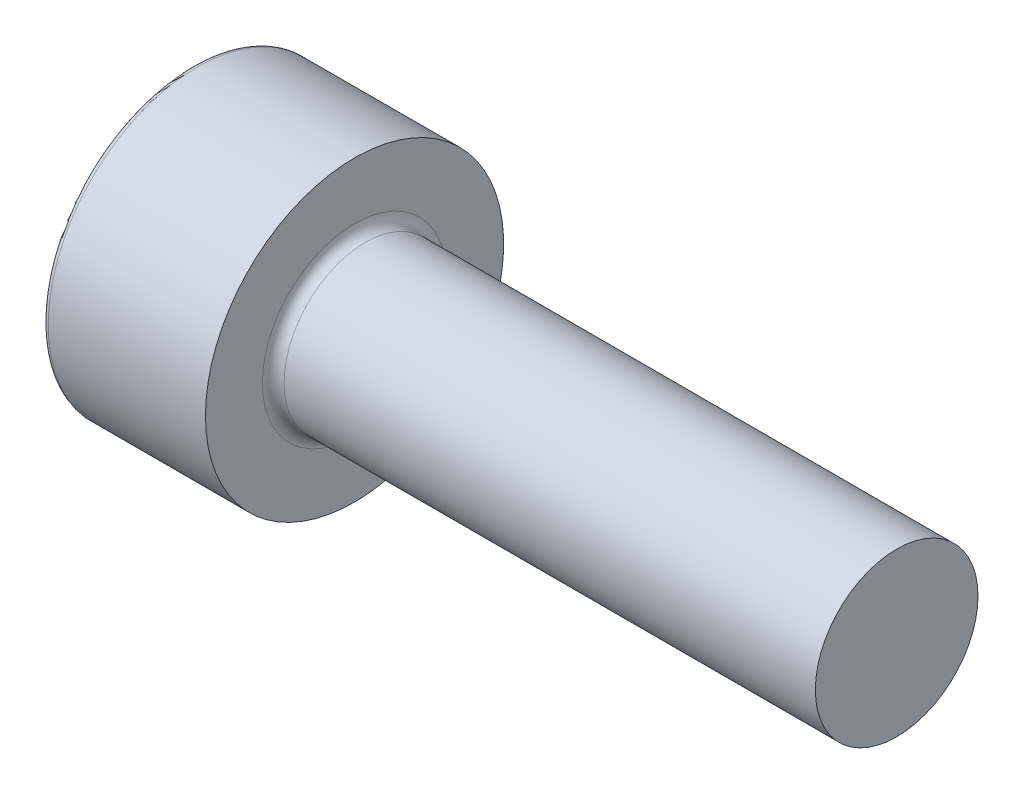
ISO-10303-21;
HEADER;
FILE_DESCRIPTION(('STEP AP214'),'2;1');
FILE_NAME('part.step','',(''),(''),'','','');
FILE_SCHEMA(('AUTOMOTIVE_DESIGN { 1 0 10303 214 1 1 1 1 }'));
ENDSEC;
DATA;
#1=APPLICATION_CONTEXT('core data for automotive mechanical design processes');
#2=APPLICATION_PROTOCOL_DEFINITION('international standard','automotive_design',2000,#1);
#3=PRODUCT_CONTEXT('',#1,'mechanical');
#4=PRODUCT('Part','Part','',(#3));
#5=PRODUCT_RELATED_PRODUCT_CATEGORY('part','',(#4));
#6=PRODUCT_DEFINITION_FORMATION('','',#4);
#7=PRODUCT_DEFINITION_CONTEXT('part definition',#1,'design');
#8=PRODUCT_DEFINITION('design','',#6,#7);
#9=PRODUCT_DEFINITION_SHAPE('','',#8);
#10=(LENGTH_UNIT() NAMED_UNIT(*) SI_UNIT(.MILLI.,.METRE.));
#11=(NAMED_UNIT(*) PLANE_ANGLE_UNIT() SI_UNIT($,.RADIAN.));
#12=(NAMED_UNIT(*) SI_UNIT($,.STERADIAN.) SOLID_ANGLE_UNIT());
#13=UNCERTAINTY_MEASURE_WITH_UNIT(LENGTH_MEASURE(1.E-05),#10,'distance_accuracy_value','');
#14=(GEOMETRIC_REPRESENTATION_CONTEXT(3) GLOBAL_UNCERTAINTY_ASSIGNED_CONTEXT((#13)) GLOBAL_UNIT_ASSIGNED_CONTEXT((#10,
#11,#12)) REPRESENTATION_CONTEXT('',''));
#15=CARTESIAN_POINT('',(0.,0.,0.));
#16=DIRECTION('',(0.,0.,1.));
#17=DIRECTION('',(1.,0.,0.));
#18=AXIS2_PLACEMENT_3D('',#15,#16,#17);
#19=CARTESIAN_POINT('',(0.,0.,0.));
#20=DIRECTION('',(-1.,0.,0.));
#21=DIRECTION('',(0.,0.,1.));
#22=AXIS2_PLACEMENT_3D('',#19,#20,#21);
#23=CYLINDRICAL_SURFACE('',#22,1.5);
#24=CARTESIAN_POINT('',(3.2,0.,0.));
#25=DIRECTION('',(-1.,0.,0.));
#26=DIRECTION('',(0.,0.,1.));
#27=AXIS2_PLACEMENT_3D('',#24,#25,#26);
#28=CIRCLE('',#27,1.5);
#29=CARTESIAN_POINT('',(3.2,0.,1.5));
#30=VERTEX_POINT('',#29);
#31=EDGE_CURVE('E158',#30,#30,#28,.T.);
#32=ORIENTED_EDGE('',*,*,#31,.F.);
#33=EDGE_LOOP('',(#32));
#34=FACE_BOUND('',#33,.T.);
#35=CARTESIAN_POINT('',(13.,0.,0.));
#36=DIRECTION('',(1.,0.,0.));
#37=DIRECTION('',(0.,0.,-1.));
#38=AXIS2_PLACEMENT_3D('',#35,#36,#37);
#39=CIRCLE('',#38,1.5);
#40=CARTESIAN_POINT('',(13.,0.,-1.5));
#41=VERTEX_POINT('',#40);
#42=EDGE_CURVE('E46',#41,#41,#39,.T.);
#43=ORIENTED_EDGE('',*,*,#42,.F.);
#44=EDGE_LOOP('',(#43));
#45=FACE_BOUND('',#44,.T.);
#46=ADVANCED_FACE('F42',(#34,#45),#23,.T.);
#47=CARTESIAN_POINT('',(0.,0.,0.));
#48=DIRECTION('',(1.,0.,0.));
#49=DIRECTION('',(0.,0.,-1.));
#50=AXIS2_PLACEMENT_3D('',#47,#48,#49);
#51=PLANE('',#50);
#52=CARTESIAN_POINT('',(0.,0.,0.));
#53=DIRECTION('',(1.,0.,0.));
#54=DIRECTION('',(0.,0.,-1.));
#55=AXIS2_PLACEMENT_3D('',#52,#53,#54);
#56=CIRCLE('',#55,2.65);
#57=CARTESIAN_POINT('',(0.,0.,-2.65));
#58=VERTEX_POINT('',#57);
#59=EDGE_CURVE('E52',#58,#58,#56,.F.);
#60=ORIENTED_EDGE('',*,*,#59,.T.);
#61=EDGE_LOOP('',(#60));
#62=FACE_BOUND('',#61,.T.);
#63=DIRECTION('',(0.,0.866025403784439,-0.5));
#64=VECTOR('',#63,1.);
#65=CARTESIAN_POINT('',(0.,0.,1.435));
#66=LINE('',#65,#64);
#67=CARTESIAN_POINT('',(0.,0.,1.435));
#68=VERTEX_POINT('',#67);
#69=CARTESIAN_POINT('',(0.,1.24274645443067,0.717499999999999));
#70=VERTEX_POINT('',#69);
#71=EDGE_CURVE('E139',#68,#70,#66,.T.);
#72=ORIENTED_EDGE('',*,*,#71,.F.);
#73=DIRECTION('',(0.,0.866025403784439,0.5));
#74=VECTOR('',#73,1.);
#75=CARTESIAN_POINT('',(0.,-1.24274645443067,0.7175));
#76=LINE('',#75,#74);
#77=CARTESIAN_POINT('',(0.,-1.24274645443067,0.7175));
#78=VERTEX_POINT('',#77);
#79=EDGE_CURVE('E59',#78,#68,#76,.T.);
#80=ORIENTED_EDGE('',*,*,#79,.F.);
#81=DIRECTION('',(0.,0.,1.));
#82=VECTOR('',#81,1.);
#83=CARTESIAN_POINT('',(0.,-1.24274645443067,-0.7175));
#84=LINE('',#83,#82);
#85=CARTESIAN_POINT('',(0.,-1.24274645443067,-0.7175));
#86=VERTEX_POINT('',#85);
#87=EDGE_CURVE('E152',#86,#78,#84,.T.);
#88=ORIENTED_EDGE('',*,*,#87,.F.);
#89=DIRECTION('',(0.,-0.866025403784439,0.5));
#90=VECTOR('',#89,1.);
#91=CARTESIAN_POINT('',(0.,0.,-1.435));
#92=LINE('',#91,#90);
#93=CARTESIAN_POINT('',(0.,0.,-1.435));
#94=VERTEX_POINT('',#93);
#95=EDGE_CURVE('E149',#94,#86,#92,.T.);
#96=ORIENTED_EDGE('',*,*,#95,.F.);
#97=DIRECTION('',(0.,-0.866025403784439,-0.5));
#98=VECTOR('',#97,1.);
#99=CARTESIAN_POINT('',(0.,1.24274645443067,-0.7175));
#100=LINE('',#99,#98);
#101=CARTESIAN_POINT('',(0.,1.24274645443067,-0.7175));
#102=VERTEX_POINT('',#101);
#103=EDGE_CURVE('E107',#102,#94,#100,.T.);
#104=ORIENTED_EDGE('',*,*,#103,.F.);
#105=DIRECTION('',(0.,0.,-1.));
#106=VECTOR('',#105,1.);
#107=CARTESIAN_POINT('',(0.,1.24274645443067,0.717499999999999));
#108=LINE('',#107,#106);
#109=EDGE_CURVE('E143',#70,#102,#108,.T.);
#110=ORIENTED_EDGE('',*,*,#109,.F.);
#111=EDGE_LOOP('',(#72,#80,#88,#96,#104,#110));
#112=FACE_BOUND('',#111,.T.);
#113=ADVANCED_FACE('F183',(#62,#112),#51,.F.);
#114=CARTESIAN_POINT('',(0.,0.,0.));
#115=DIRECTION('',(-1.,0.,0.));
#116=DIRECTION('',(0.,0.,1.));
#117=AXIS2_PLACEMENT_3D('',#114,#115,#116);
#118=CYLINDRICAL_SURFACE('',#117,2.75);
#119=CARTESIAN_POINT('',(0.1,0.,0.));
#120=DIRECTION('',(1.,0.,0.));
#121=DIRECTION('',(0.,0.,-1.));
#122=AXIS2_PLACEMENT_3D('',#119,#120,#121);
#123=CIRCLE('',#122,2.75);
#124=CARTESIAN_POINT('',(0.1,0.,-2.75));
#125=VERTEX_POINT('',#124);
#126=EDGE_CURVE('E11',#125,#125,#123,.T.);
#127=ORIENTED_EDGE('',*,*,#126,.T.);
#128=EDGE_LOOP('',(#127));
#129=FACE_BOUND('',#128,.T.);
#130=CARTESIAN_POINT('',(3.,0.,0.));
#131=DIRECTION('',(-1.,0.,0.));
#132=DIRECTION('',(0.,0.,1.));
#133=AXIS2_PLACEMENT_3D('',#130,#131,#132);
#134=CIRCLE('',#133,2.75);
#135=CARTESIAN_POINT('',(3.,0.,2.75));
#136=VERTEX_POINT('',#135);
#137=EDGE_CURVE('E175',#136,#136,#134,.T.);
#138=ORIENTED_EDGE('',*,*,#137,.T.);
#139=EDGE_LOOP('',(#138));
#140=FACE_BOUND('',#139,.T.);
#141=ADVANCED_FACE('F204',(#129,#140),#118,.T.);
#142=CARTESIAN_POINT('',(3.,2.75,0.));
#143=DIRECTION('',(-1.,0.,0.));
#144=DIRECTION('',(0.,0.,1.));
#145=AXIS2_PLACEMENT_3D('',#142,#143,#144);
#146=PLANE('',#145);
#147=ORIENTED_EDGE('',*,*,#137,.F.);
#148=EDGE_LOOP('',(#147));
#149=FACE_BOUND('',#148,.T.);
#150=CARTESIAN_POINT('',(3.,0.,0.));
#151=DIRECTION('',(-1.,0.,0.));
#152=DIRECTION('',(0.,0.,1.));
#153=AXIS2_PLACEMENT_3D('',#150,#151,#152);
#154=CIRCLE('',#153,1.7);
#155=CARTESIAN_POINT('',(3.,0.,1.7));
#156=VERTEX_POINT('',#155);
#157=EDGE_CURVE('E171',#156,#156,#154,.T.);
#158=ORIENTED_EDGE('',*,*,#157,.T.);
#159=EDGE_LOOP('',(#158));
#160=FACE_BOUND('',#159,.T.);
#161=ADVANCED_FACE('F214',(#149,#160),#146,.F.);
#162=CARTESIAN_POINT('',(3.2,0.,0.));
#163=DIRECTION('',(-1.,0.,0.));
#164=DIRECTION('',(0.,0.,1.));
#165=AXIS2_PLACEMENT_3D('',#162,#163,#164);
#166=TOROIDAL_SURFACE('',#165,1.7,0.2);
#167=ORIENTED_EDGE('',*,*,#157,.F.);
#168=EDGE_LOOP('',(#167));
#169=FACE_BOUND('',#168,.T.);
#170=ORIENTED_EDGE('',*,*,#31,.T.);
#171=EDGE_LOOP('',(#170));
#172=FACE_BOUND('',#171,.T.);
#173=ADVANCED_FACE('F211',(#169,#172),#166,.F.);
#174=CARTESIAN_POINT('',(1.3,-1.24274645443067,0.7175));
#175=DIRECTION('',(0.,-0.5,0.866025403784439));
#176=DIRECTION('',(0.,-0.866025403784439,-0.5));
#177=AXIS2_PLACEMENT_3D('',#174,#175,#176);
#178=PLANE('',#177);
#179=ORIENTED_EDGE('',*,*,#79,.T.);
#180=DIRECTION('',(-1.,0.,0.));
#181=VECTOR('',#180,1.);
#182=CARTESIAN_POINT('',(1.3,0.,1.435));
#183=LINE('',#182,#181);
#184=CARTESIAN_POINT('',(1.3,0.,1.435));
#185=VERTEX_POINT('',#184);
#186=EDGE_CURVE('E89',#185,#68,#183,.T.);
#187=ORIENTED_EDGE('',*,*,#186,.F.);
#188=DIRECTION('',(0.,0.866025403784439,0.5));
#189=VECTOR('',#188,1.);
#190=CARTESIAN_POINT('',(1.3,-1.24274645443067,0.7175));
#191=LINE('',#190,#189);
#192=CARTESIAN_POINT('',(1.3,-1.24274645443067,0.7175));
#193=VERTEX_POINT('',#192);
#194=EDGE_CURVE('E155',#193,#185,#191,.T.);
#195=ORIENTED_EDGE('',*,*,#194,.F.);
#196=DIRECTION('',(-1.,0.,0.));
#197=VECTOR('',#196,1.);
#198=CARTESIAN_POINT('',(1.3,-1.24274645443067,0.7175));
#199=LINE('',#198,#197);
#200=EDGE_CURVE('E67',#193,#78,#199,.T.);
#201=ORIENTED_EDGE('',*,*,#200,.T.);
#202=EDGE_LOOP('',(#179,#187,#195,#201));
#203=FACE_BOUND('',#202,.T.);
#204=ADVANCED_FACE('F209',(#203),#178,.F.);
#205=CARTESIAN_POINT('',(1.3,-1.24274645443067,-0.7175));
#206=DIRECTION('',(0.,-1.,0.));
#207=DIRECTION('',(0.,0.,-1.));
#208=AXIS2_PLACEMENT_3D('',#205,#206,#207);
#209=PLANE('',#208);
#210=ORIENTED_EDGE('',*,*,#87,.T.);
#211=ORIENTED_EDGE('',*,*,#200,.F.);
#212=DIRECTION('',(0.,0.,1.));
#213=VECTOR('',#212,1.);
#214=CARTESIAN_POINT('',(1.3,-1.24274645443067,-0.7175));
#215=LINE('',#214,#213);
#216=CARTESIAN_POINT('',(1.3,-1.24274645443067,-0.7175));
#217=VERTEX_POINT('',#216);
#218=EDGE_CURVE('E121',#217,#193,#215,.T.);
#219=ORIENTED_EDGE('',*,*,#218,.F.);
#220=DIRECTION('',(-1.,0.,0.));
#221=VECTOR('',#220,1.);
#222=CARTESIAN_POINT('',(1.3,-1.24274645443067,-0.7175));
#223=LINE('',#222,#221);
#224=EDGE_CURVE('E112',#217,#86,#223,.T.);
#225=ORIENTED_EDGE('',*,*,#224,.T.);
#226=EDGE_LOOP('',(#210,#211,#219,#225));
#227=FACE_BOUND('',#226,.T.);
#228=ADVANCED_FACE('F244',(#227),#209,.F.);
#229=CARTESIAN_POINT('',(1.3,0.,-1.435));
#230=DIRECTION('',(0.,-0.5,-0.866025403784439));
#231=DIRECTION('',(0.,0.866025403784439,-0.5));
#232=AXIS2_PLACEMENT_3D('',#229,#230,#231);
#233=PLANE('',#232);
#234=ORIENTED_EDGE('',*,*,#95,.T.);
#235=ORIENTED_EDGE('',*,*,#224,.F.);
#236=DIRECTION('',(0.,-0.866025403784439,0.5));
#237=VECTOR('',#236,1.);
#238=CARTESIAN_POINT('',(1.3,0.,-1.435));
#239=LINE('',#238,#237);
#240=CARTESIAN_POINT('',(1.3,0.,-1.435));
#241=VERTEX_POINT('',#240);
#242=EDGE_CURVE('E116',#241,#217,#239,.T.);
#243=ORIENTED_EDGE('',*,*,#242,.F.);
#244=DIRECTION('',(-1.,0.,0.));
#245=VECTOR('',#244,1.);
#246=CARTESIAN_POINT('',(1.3,0.,-1.435));
#247=LINE('',#246,#245);
#248=EDGE_CURVE('E100',#241,#94,#247,.T.);
#249=ORIENTED_EDGE('',*,*,#248,.T.);
#250=EDGE_LOOP('',(#234,#235,#243,#249));
#251=FACE_BOUND('',#250,.T.);
#252=ADVANCED_FACE('F117',(#251),#233,.F.);
#253=CARTESIAN_POINT('',(1.3,1.24274645443067,-0.7175));
#254=DIRECTION('',(0.,0.5,-0.866025403784439));
#255=DIRECTION('',(0.,0.866025403784439,0.5));
#256=AXIS2_PLACEMENT_3D('',#253,#254,#255);
#257=PLANE('',#256);
#258=ORIENTED_EDGE('',*,*,#103,.T.);
#259=ORIENTED_EDGE('',*,*,#248,.F.);
#260=DIRECTION('',(0.,-0.866025403784439,-0.5));
#261=VECTOR('',#260,1.);
#262=CARTESIAN_POINT('',(1.3,1.24274645443067,-0.7175));
#263=LINE('',#262,#261);
#264=CARTESIAN_POINT('',(1.3,1.24274645443067,-0.7175));
#265=VERTEX_POINT('',#264);
#266=EDGE_CURVE('E104',#265,#241,#263,.T.);
#267=ORIENTED_EDGE('',*,*,#266,.F.);
#268=DIRECTION('',(-1.,0.,0.));
#269=VECTOR('',#268,1.);
#270=CARTESIAN_POINT('',(1.3,1.24274645443067,-0.7175));
#271=LINE('',#270,#269);
#272=EDGE_CURVE('E113',#265,#102,#271,.T.);
#273=ORIENTED_EDGE('',*,*,#272,.T.);
#274=EDGE_LOOP('',(#258,#259,#267,#273));
#275=FACE_BOUND('',#274,.T.);
#276=ADVANCED_FACE('F102',(#275),#257,.F.);
#277=CARTESIAN_POINT('',(1.3,1.24274645443067,0.717499999999999));
#278=DIRECTION('',(0.,1.,0.));
#279=DIRECTION('',(0.,0.,1.));
#280=AXIS2_PLACEMENT_3D('',#277,#278,#279);
#281=PLANE('',#280);
#282=ORIENTED_EDGE('',*,*,#109,.T.);
#283=ORIENTED_EDGE('',*,*,#272,.F.);
#284=DIRECTION('',(0.,0.,-1.));
#285=VECTOR('',#284,1.);
#286=CARTESIAN_POINT('',(1.3,1.24274645443067,0.717499999999999));
#287=LINE('',#286,#285);
#288=CARTESIAN_POINT('',(1.3,1.24274645443067,0.717499999999999));
#289=VERTEX_POINT('',#288);
#290=EDGE_CURVE('E127',#289,#265,#287,.T.);
#291=ORIENTED_EDGE('',*,*,#290,.F.);
#292=DIRECTION('',(-1.,0.,0.));
#293=VECTOR('',#292,1.);
#294=CARTESIAN_POINT('',(1.3,1.24274645443067,0.717499999999999));
#295=LINE('',#294,#293);
#296=EDGE_CURVE('E163',#289,#70,#295,.T.);
#297=ORIENTED_EDGE('',*,*,#296,.T.);
#298=EDGE_LOOP('',(#282,#283,#291,#297));
#299=FACE_BOUND('',#298,.T.);
#300=ADVANCED_FACE('F262',(#299),#281,.F.);
#301=CARTESIAN_POINT('',(1.3,0.,1.435));
#302=DIRECTION('',(0.,0.5,0.866025403784439));
#303=DIRECTION('',(0.,-0.866025403784439,0.5));
#304=AXIS2_PLACEMENT_3D('',#301,#302,#303);
#305=PLANE('',#304);
#306=ORIENTED_EDGE('',*,*,#71,.T.);
#307=ORIENTED_EDGE('',*,*,#296,.F.);
#308=DIRECTION('',(0.,0.866025403784439,-0.5));
#309=VECTOR('',#308,1.);
#310=CARTESIAN_POINT('',(1.3,0.,1.435));
#311=LINE('',#310,#309);
#312=EDGE_CURVE('E131',#185,#289,#311,.T.);
#313=ORIENTED_EDGE('',*,*,#312,.F.);
#314=ORIENTED_EDGE('',*,*,#186,.T.);
#315=EDGE_LOOP('',(#306,#307,#313,#314));
#316=FACE_BOUND('',#315,.T.);
#317=ADVANCED_FACE('F195',(#316),#305,.F.);
#318=CARTESIAN_POINT('',(1.3,-1.24274645443067,0.7175));
#319=DIRECTION('',(1.,0.,0.));
#320=DIRECTION('',(0.,0.,-1.));
#321=AXIS2_PLACEMENT_3D('',#318,#319,#320);
#322=PLANE('',#321);
#323=ORIENTED_EDGE('',*,*,#194,.T.);
#324=ORIENTED_EDGE('',*,*,#312,.T.);
#325=ORIENTED_EDGE('',*,*,#290,.T.);
#326=ORIENTED_EDGE('',*,*,#266,.T.);
#327=ORIENTED_EDGE('',*,*,#242,.T.);
#328=ORIENTED_EDGE('',*,*,#218,.T.);
#329=EDGE_LOOP('',(#323,#324,#325,#326,#327,#328));
#330=FACE_BOUND('',#329,.T.);
#331=ADVANCED_FACE('F124',(#330),#322,.F.);
#332=CARTESIAN_POINT('',(0.1,0.,0.));
#333=DIRECTION('',(1.,0.,0.));
#334=DIRECTION('',(0.,0.,-1.));
#335=AXIS2_PLACEMENT_3D('',#332,#333,#334);
#336=TOROIDAL_SURFACE('',#335,2.65,0.1);
#337=ORIENTED_EDGE('',*,*,#126,.F.);
#338=EDGE_LOOP('',(#337));
#339=FACE_BOUND('',#338,.T.);
#340=ORIENTED_EDGE('',*,*,#59,.F.);
#341=EDGE_LOOP('',(#340));
#342=FACE_BOUND('',#341,.T.);
#343=ADVANCED_FACE('F44',(#339,#342),#336,.T.);
#344=CARTESIAN_POINT('',(13.,0.211051496960169,0.308855849209906));
#345=DIRECTION('',(1.,0.,0.));
#346=DIRECTION('',(0.,0.,-1.));
#347=AXIS2_PLACEMENT_3D('',#344,#345,#346);
#348=PLANE('',#347);
#349=ORIENTED_EDGE('',*,*,#42,.T.);
#350=EDGE_LOOP('',(#349));
#351=FACE_BOUND('',#350,.T.);
#352=ADVANCED_FACE('F187',(#351),#348,.T.);
#353=CLOSED_SHELL('',(#46,#113,#141,#161,#173,#204,#228,#252,#276,#300,#317,#331,#343,#352));
#354=MANIFOLD_SOLID_BREP('B2',#353);
#355=ADVANCED_BREP_SHAPE_REPRESENTATION('',(#18,#354),#14);
#356=SHAPE_DEFINITION_REPRESENTATION(#9,#355);
ENDSEC;
END-ISO-10303-21;
